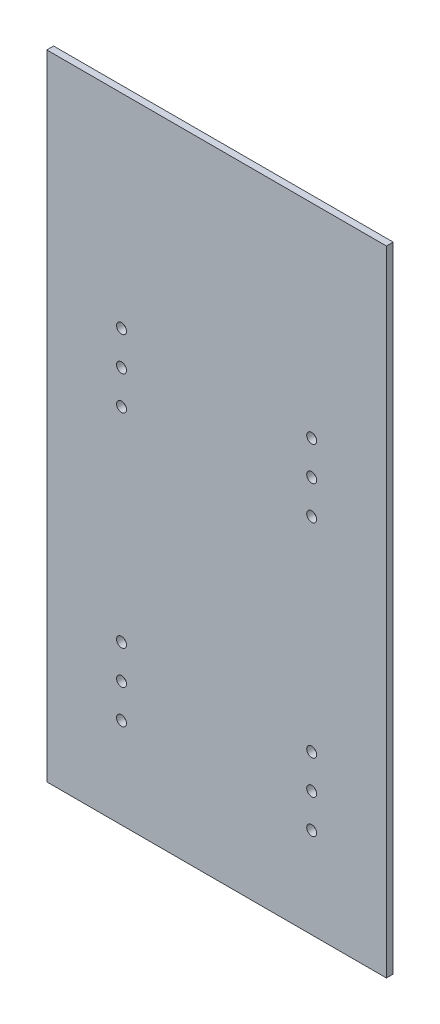
ISO-10303-21;
HEADER;
FILE_DESCRIPTION(('STEP AP214'),'2;1');
FILE_NAME('part.step','',(''),(''),'','','');
FILE_SCHEMA(('AUTOMOTIVE_DESIGN { 1 0 10303 214 1 1 1 1 }'));
ENDSEC;
DATA;
#1=APPLICATION_CONTEXT('core data for automotive mechanical design processes');
#2=APPLICATION_PROTOCOL_DEFINITION('international standard','automotive_design',2000,#1);
#3=PRODUCT_CONTEXT('',#1,'mechanical');
#4=PRODUCT('Part','Part','',(#3));
#5=PRODUCT_RELATED_PRODUCT_CATEGORY('part','',(#4));
#6=PRODUCT_DEFINITION_FORMATION('','',#4);
#7=PRODUCT_DEFINITION_CONTEXT('part definition',#1,'design');
#8=PRODUCT_DEFINITION('design','',#6,#7);
#9=PRODUCT_DEFINITION_SHAPE('','',#8);
#10=(LENGTH_UNIT() NAMED_UNIT(*) SI_UNIT(.MILLI.,.METRE.));
#11=(NAMED_UNIT(*) PLANE_ANGLE_UNIT() SI_UNIT($,.RADIAN.));
#12=(NAMED_UNIT(*) SI_UNIT($,.STERADIAN.) SOLID_ANGLE_UNIT());
#13=UNCERTAINTY_MEASURE_WITH_UNIT(LENGTH_MEASURE(1.E-05),#10,'distance_accuracy_value','');
#14=(GEOMETRIC_REPRESENTATION_CONTEXT(3) GLOBAL_UNCERTAINTY_ASSIGNED_CONTEXT((#13)) GLOBAL_UNIT_ASSIGNED_CONTEXT((#10,
#11,#12)) REPRESENTATION_CONTEXT('',''));
#15=CARTESIAN_POINT('',(0.,0.,0.));
#16=DIRECTION('',(0.,0.,1.));
#17=DIRECTION('',(1.,0.,0.));
#18=AXIS2_PLACEMENT_3D('',#15,#16,#17);
#19=CARTESIAN_POINT('',(0.,0.,3.));
#20=DIRECTION('',(0.,0.,-1.));
#21=DIRECTION('',(-1.,0.,0.));
#22=AXIS2_PLACEMENT_3D('',#19,#20,#21);
#23=PLANE('',#22);
#24=CARTESIAN_POINT('',(263.043137643902,1067.69288200509,3.));
#25=DIRECTION('',(0.,0.,-1.));
#26=DIRECTION('',(-1.,0.,0.));
#27=AXIS2_PLACEMENT_3D('',#24,#25,#26);
#28=CIRCLE('',#27,2.20000000000012);
#29=CARTESIAN_POINT('',(260.843137643902,1067.69288200509,3.));
#30=VERTEX_POINT('',#29);
#31=EDGE_CURVE('E254',#30,#30,#28,.T.);
#32=ORIENTED_EDGE('',*,*,#31,.T.);
#33=EDGE_LOOP('',(#32));
#34=FACE_BOUND('',#33,.T.);
#35=CARTESIAN_POINT('',(263.043137643902,1082.69288200509,3.));
#36=DIRECTION('',(0.,0.,-1.));
#37=DIRECTION('',(-1.,0.,0.));
#38=AXIS2_PLACEMENT_3D('',#35,#36,#37);
#39=CIRCLE('',#38,2.20000000000012);
#40=CARTESIAN_POINT('',(260.843137643902,1082.69288200509,3.));
#41=VERTEX_POINT('',#40);
#42=EDGE_CURVE('E316',#41,#41,#39,.T.);
#43=ORIENTED_EDGE('',*,*,#42,.T.);
#44=EDGE_LOOP('',(#43));
#45=FACE_BOUND('',#44,.T.);
#46=CARTESIAN_POINT('',(179.043137643902,1082.69288200509,3.));
#47=DIRECTION('',(0.,0.,-1.));
#48=DIRECTION('',(-1.,0.,0.));
#49=AXIS2_PLACEMENT_3D('',#46,#47,#48);
#50=CIRCLE('',#49,2.20000000000014);
#51=CARTESIAN_POINT('',(176.843137643902,1082.69288200509,3.));
#52=VERTEX_POINT('',#51);
#53=EDGE_CURVE('E313',#52,#52,#50,.T.);
#54=ORIENTED_EDGE('',*,*,#53,.T.);
#55=EDGE_LOOP('',(#54));
#56=FACE_BOUND('',#55,.T.);
#57=CARTESIAN_POINT('',(179.043137643902,1067.69288200509,3.));
#58=DIRECTION('',(0.,0.,-1.));
#59=DIRECTION('',(-1.,0.,0.));
#60=AXIS2_PLACEMENT_3D('',#57,#58,#59);
#61=CIRCLE('',#60,2.20000000000014);
#62=CARTESIAN_POINT('',(176.843137643902,1067.69288200509,3.));
#63=VERTEX_POINT('',#62);
#64=EDGE_CURVE('E310',#63,#63,#61,.T.);
#65=ORIENTED_EDGE('',*,*,#64,.T.);
#66=EDGE_LOOP('',(#65));
#67=FACE_BOUND('',#66,.T.);
#68=CARTESIAN_POINT('',(179.043137643902,1052.69288200509,3.));
#69=DIRECTION('',(0.,0.,-1.));
#70=DIRECTION('',(-1.,0.,0.));
#71=AXIS2_PLACEMENT_3D('',#68,#69,#70);
#72=CIRCLE('',#71,2.20000000000014);
#73=CARTESIAN_POINT('',(176.843137643902,1052.69288200509,3.));
#74=VERTEX_POINT('',#73);
#75=EDGE_CURVE('E306',#74,#74,#72,.T.);
#76=ORIENTED_EDGE('',*,*,#75,.T.);
#77=EDGE_LOOP('',(#76));
#78=FACE_BOUND('',#77,.T.);
#79=CARTESIAN_POINT('',(179.043137643902,962.692882005094,3.));
#80=DIRECTION('',(0.,0.,-1.));
#81=DIRECTION('',(-1.,0.,0.));
#82=AXIS2_PLACEMENT_3D('',#79,#80,#81);
#83=CIRCLE('',#82,2.20000000000001);
#84=CARTESIAN_POINT('',(176.843137643902,962.692882005094,3.));
#85=VERTEX_POINT('',#84);
#86=EDGE_CURVE('E302',#85,#85,#83,.T.);
#87=ORIENTED_EDGE('',*,*,#86,.T.);
#88=EDGE_LOOP('',(#87));
#89=FACE_BOUND('',#88,.T.);
#90=CARTESIAN_POINT('',(179.043137643902,947.692882005094,3.));
#91=DIRECTION('',(0.,0.,-1.));
#92=DIRECTION('',(-1.,0.,0.));
#93=AXIS2_PLACEMENT_3D('',#90,#91,#92);
#94=CIRCLE('',#93,2.19999999999998);
#95=CARTESIAN_POINT('',(176.843137643902,947.692882005094,3.));
#96=VERTEX_POINT('',#95);
#97=EDGE_CURVE('E298',#96,#96,#94,.T.);
#98=ORIENTED_EDGE('',*,*,#97,.T.);
#99=EDGE_LOOP('',(#98));
#100=FACE_BOUND('',#99,.T.);
#101=CARTESIAN_POINT('',(179.043137643902,932.692882005094,3.));
#102=DIRECTION('',(0.,0.,-1.));
#103=DIRECTION('',(-1.,0.,0.));
#104=AXIS2_PLACEMENT_3D('',#101,#102,#103);
#105=CIRCLE('',#104,2.19999999999998);
#106=CARTESIAN_POINT('',(176.843137643902,932.692882005094,3.));
#107=VERTEX_POINT('',#106);
#108=EDGE_CURVE('E294',#107,#107,#105,.T.);
#109=ORIENTED_EDGE('',*,*,#108,.T.);
#110=EDGE_LOOP('',(#109));
#111=FACE_BOUND('',#110,.T.);
#112=CARTESIAN_POINT('',(263.043137643902,932.692882005094,3.));
#113=DIRECTION('',(0.,0.,-1.));
#114=DIRECTION('',(-1.,0.,0.));
#115=AXIS2_PLACEMENT_3D('',#112,#113,#114);
#116=CIRCLE('',#115,2.19999999999998);
#117=CARTESIAN_POINT('',(260.843137643902,932.692882005094,3.));
#118=VERTEX_POINT('',#117);
#119=EDGE_CURVE('E290',#118,#118,#116,.T.);
#120=ORIENTED_EDGE('',*,*,#119,.T.);
#121=EDGE_LOOP('',(#120));
#122=FACE_BOUND('',#121,.T.);
#123=CARTESIAN_POINT('',(263.043137643902,947.692882005094,3.));
#124=DIRECTION('',(0.,0.,-1.));
#125=DIRECTION('',(-1.,0.,0.));
#126=AXIS2_PLACEMENT_3D('',#123,#124,#125);
#127=CIRCLE('',#126,2.19999999999998);
#128=CARTESIAN_POINT('',(260.843137643902,947.692882005094,3.));
#129=VERTEX_POINT('',#128);
#130=EDGE_CURVE('E286',#129,#129,#127,.T.);
#131=ORIENTED_EDGE('',*,*,#130,.T.);
#132=EDGE_LOOP('',(#131));
#133=FACE_BOUND('',#132,.T.);
#134=CARTESIAN_POINT('',(263.043137643902,962.692882005094,3.));
#135=DIRECTION('',(0.,0.,-1.));
#136=DIRECTION('',(-1.,0.,0.));
#137=AXIS2_PLACEMENT_3D('',#134,#135,#136);
#138=CIRCLE('',#137,2.20000000000003);
#139=CARTESIAN_POINT('',(260.843137643902,962.692882005094,3.));
#140=VERTEX_POINT('',#139);
#141=EDGE_CURVE('E282',#140,#140,#138,.T.);
#142=ORIENTED_EDGE('',*,*,#141,.T.);
#143=EDGE_LOOP('',(#142));
#144=FACE_BOUND('',#143,.T.);
#145=CARTESIAN_POINT('',(263.043137643902,1052.69288200509,3.));
#146=DIRECTION('',(0.,0.,-1.));
#147=DIRECTION('',(-1.,0.,0.));
#148=AXIS2_PLACEMENT_3D('',#145,#146,#147);
#149=CIRCLE('',#148,2.20000000000012);
#150=CARTESIAN_POINT('',(260.843137643902,1052.69288200509,3.));
#151=VERTEX_POINT('',#150);
#152=EDGE_CURVE('E278',#151,#151,#149,.T.);
#153=ORIENTED_EDGE('',*,*,#152,.T.);
#154=EDGE_LOOP('',(#153));
#155=FACE_BOUND('',#154,.T.);
#156=DIRECTION('',(0.,-1.,0.));
#157=VECTOR('',#156,1.);
#158=CARTESIAN_POINT('',(146.043137643902,1172.69288200509,3.));
#159=LINE('',#158,#157);
#160=CARTESIAN_POINT('',(146.043137643902,1172.69288200509,3.));
#161=VERTEX_POINT('',#160);
#162=CARTESIAN_POINT('',(146.043137643902,892.692882005094,3.));
#163=VERTEX_POINT('',#162);
#164=EDGE_CURVE('E182',#161,#163,#159,.T.);
#165=ORIENTED_EDGE('',*,*,#164,.T.);
#166=DIRECTION('',(1.,0.,0.));
#167=VECTOR('',#166,1.);
#168=CARTESIAN_POINT('',(296.043137643902,892.692882005094,3.));
#169=LINE('',#168,#167);
#170=CARTESIAN_POINT('',(296.043137643902,892.692882005094,3.));
#171=VERTEX_POINT('',#170);
#172=EDGE_CURVE('E228',#163,#171,#169,.T.);
#173=ORIENTED_EDGE('',*,*,#172,.T.);
#174=DIRECTION('',(0.,1.,0.));
#175=VECTOR('',#174,1.);
#176=CARTESIAN_POINT('',(296.043137643902,1172.69288200509,3.));
#177=LINE('',#176,#175);
#178=CARTESIAN_POINT('',(296.043137643902,1172.69288200509,3.));
#179=VERTEX_POINT('',#178);
#180=EDGE_CURVE('E209',#171,#179,#177,.T.);
#181=ORIENTED_EDGE('',*,*,#180,.T.);
#182=DIRECTION('',(-1.,0.,0.));
#183=VECTOR('',#182,1.);
#184=CARTESIAN_POINT('',(296.043137643902,1172.69288200509,3.));
#185=LINE('',#184,#183);
#186=EDGE_CURVE('E203',#179,#161,#185,.T.);
#187=ORIENTED_EDGE('',*,*,#186,.T.);
#188=EDGE_LOOP('',(#165,#173,#181,#187));
#189=FACE_BOUND('',#188,.T.);
#190=ADVANCED_FACE('F173',(#34,#45,#56,#67,#78,#89,#100,#111,#122,#133,#144,#155,#189),#23,.F.);
#191=CARTESIAN_POINT('',(0.,0.,0.));
#192=DIRECTION('',(0.,0.,-1.));
#193=DIRECTION('',(-1.,0.,0.));
#194=AXIS2_PLACEMENT_3D('',#191,#192,#193);
#195=PLANE('',#194);
#196=CARTESIAN_POINT('',(263.043137643902,1067.69288200509,0.));
#197=DIRECTION('',(0.,0.,-1.));
#198=DIRECTION('',(-1.,0.,0.));
#199=AXIS2_PLACEMENT_3D('',#196,#197,#198);
#200=CIRCLE('',#199,2.20000000000012);
#201=CARTESIAN_POINT('',(260.843137643902,1067.69288200509,0.));
#202=VERTEX_POINT('',#201);
#203=EDGE_CURVE('E176',#202,#202,#200,.T.);
#204=ORIENTED_EDGE('',*,*,#203,.F.);
#205=EDGE_LOOP('',(#204));
#206=FACE_BOUND('',#205,.T.);
#207=CARTESIAN_POINT('',(263.043137643902,1082.69288200509,0.));
#208=DIRECTION('',(0.,0.,-1.));
#209=DIRECTION('',(-1.,0.,0.));
#210=AXIS2_PLACEMENT_3D('',#207,#208,#209);
#211=CIRCLE('',#210,2.20000000000012);
#212=CARTESIAN_POINT('',(260.843137643902,1082.69288200509,0.));
#213=VERTEX_POINT('',#212);
#214=EDGE_CURVE('E314',#213,#213,#211,.T.);
#215=ORIENTED_EDGE('',*,*,#214,.F.);
#216=EDGE_LOOP('',(#215));
#217=FACE_BOUND('',#216,.T.);
#218=CARTESIAN_POINT('',(179.043137643902,1082.69288200509,0.));
#219=DIRECTION('',(0.,0.,-1.));
#220=DIRECTION('',(-1.,0.,0.));
#221=AXIS2_PLACEMENT_3D('',#218,#219,#220);
#222=CIRCLE('',#221,2.20000000000014);
#223=CARTESIAN_POINT('',(176.843137643902,1082.69288200509,0.));
#224=VERTEX_POINT('',#223);
#225=EDGE_CURVE('E311',#224,#224,#222,.T.);
#226=ORIENTED_EDGE('',*,*,#225,.F.);
#227=EDGE_LOOP('',(#226));
#228=FACE_BOUND('',#227,.T.);
#229=CARTESIAN_POINT('',(179.043137643902,1067.69288200509,0.));
#230=DIRECTION('',(0.,0.,-1.));
#231=DIRECTION('',(-1.,0.,0.));
#232=AXIS2_PLACEMENT_3D('',#229,#230,#231);
#233=CIRCLE('',#232,2.20000000000014);
#234=CARTESIAN_POINT('',(176.843137643902,1067.69288200509,0.));
#235=VERTEX_POINT('',#234);
#236=EDGE_CURVE('E307',#235,#235,#233,.T.);
#237=ORIENTED_EDGE('',*,*,#236,.F.);
#238=EDGE_LOOP('',(#237));
#239=FACE_BOUND('',#238,.T.);
#240=CARTESIAN_POINT('',(179.043137643902,1052.69288200509,0.));
#241=DIRECTION('',(0.,0.,-1.));
#242=DIRECTION('',(-1.,0.,0.));
#243=AXIS2_PLACEMENT_3D('',#240,#241,#242);
#244=CIRCLE('',#243,2.20000000000014);
#245=CARTESIAN_POINT('',(176.843137643902,1052.69288200509,0.));
#246=VERTEX_POINT('',#245);
#247=EDGE_CURVE('E303',#246,#246,#244,.T.);
#248=ORIENTED_EDGE('',*,*,#247,.F.);
#249=EDGE_LOOP('',(#248));
#250=FACE_BOUND('',#249,.T.);
#251=CARTESIAN_POINT('',(179.043137643902,962.692882005094,0.));
#252=DIRECTION('',(0.,0.,-1.));
#253=DIRECTION('',(-1.,0.,0.));
#254=AXIS2_PLACEMENT_3D('',#251,#252,#253);
#255=CIRCLE('',#254,2.20000000000001);
#256=CARTESIAN_POINT('',(176.843137643902,962.692882005094,0.));
#257=VERTEX_POINT('',#256);
#258=EDGE_CURVE('E299',#257,#257,#255,.T.);
#259=ORIENTED_EDGE('',*,*,#258,.F.);
#260=EDGE_LOOP('',(#259));
#261=FACE_BOUND('',#260,.T.);
#262=CARTESIAN_POINT('',(179.043137643902,947.692882005094,0.));
#263=DIRECTION('',(0.,0.,-1.));
#264=DIRECTION('',(-1.,0.,0.));
#265=AXIS2_PLACEMENT_3D('',#262,#263,#264);
#266=CIRCLE('',#265,2.19999999999998);
#267=CARTESIAN_POINT('',(176.843137643902,947.692882005094,0.));
#268=VERTEX_POINT('',#267);
#269=EDGE_CURVE('E295',#268,#268,#266,.T.);
#270=ORIENTED_EDGE('',*,*,#269,.F.);
#271=EDGE_LOOP('',(#270));
#272=FACE_BOUND('',#271,.T.);
#273=CARTESIAN_POINT('',(179.043137643902,932.692882005094,0.));
#274=DIRECTION('',(0.,0.,-1.));
#275=DIRECTION('',(-1.,0.,0.));
#276=AXIS2_PLACEMENT_3D('',#273,#274,#275);
#277=CIRCLE('',#276,2.19999999999998);
#278=CARTESIAN_POINT('',(176.843137643902,932.692882005094,0.));
#279=VERTEX_POINT('',#278);
#280=EDGE_CURVE('E291',#279,#279,#277,.T.);
#281=ORIENTED_EDGE('',*,*,#280,.F.);
#282=EDGE_LOOP('',(#281));
#283=FACE_BOUND('',#282,.T.);
#284=CARTESIAN_POINT('',(263.043137643902,932.692882005094,0.));
#285=DIRECTION('',(0.,0.,-1.));
#286=DIRECTION('',(-1.,0.,0.));
#287=AXIS2_PLACEMENT_3D('',#284,#285,#286);
#288=CIRCLE('',#287,2.19999999999998);
#289=CARTESIAN_POINT('',(260.843137643902,932.692882005094,0.));
#290=VERTEX_POINT('',#289);
#291=EDGE_CURVE('E287',#290,#290,#288,.T.);
#292=ORIENTED_EDGE('',*,*,#291,.F.);
#293=EDGE_LOOP('',(#292));
#294=FACE_BOUND('',#293,.T.);
#295=CARTESIAN_POINT('',(263.043137643902,947.692882005094,0.));
#296=DIRECTION('',(0.,0.,-1.));
#297=DIRECTION('',(-1.,0.,0.));
#298=AXIS2_PLACEMENT_3D('',#295,#296,#297);
#299=CIRCLE('',#298,2.19999999999998);
#300=CARTESIAN_POINT('',(260.843137643902,947.692882005094,0.));
#301=VERTEX_POINT('',#300);
#302=EDGE_CURVE('E283',#301,#301,#299,.T.);
#303=ORIENTED_EDGE('',*,*,#302,.F.);
#304=EDGE_LOOP('',(#303));
#305=FACE_BOUND('',#304,.T.);
#306=CARTESIAN_POINT('',(263.043137643902,962.692882005094,0.));
#307=DIRECTION('',(0.,0.,-1.));
#308=DIRECTION('',(-1.,0.,0.));
#309=AXIS2_PLACEMENT_3D('',#306,#307,#308);
#310=CIRCLE('',#309,2.20000000000003);
#311=CARTESIAN_POINT('',(260.843137643902,962.692882005094,0.));
#312=VERTEX_POINT('',#311);
#313=EDGE_CURVE('E279',#312,#312,#310,.T.);
#314=ORIENTED_EDGE('',*,*,#313,.F.);
#315=EDGE_LOOP('',(#314));
#316=FACE_BOUND('',#315,.T.);
#317=CARTESIAN_POINT('',(263.043137643902,1052.69288200509,0.));
#318=DIRECTION('',(0.,0.,-1.));
#319=DIRECTION('',(-1.,0.,0.));
#320=AXIS2_PLACEMENT_3D('',#317,#318,#319);
#321=CIRCLE('',#320,2.20000000000012);
#322=CARTESIAN_POINT('',(260.843137643902,1052.69288200509,0.));
#323=VERTEX_POINT('',#322);
#324=EDGE_CURVE('E275',#323,#323,#321,.T.);
#325=ORIENTED_EDGE('',*,*,#324,.F.);
#326=EDGE_LOOP('',(#325));
#327=FACE_BOUND('',#326,.T.);
#328=DIRECTION('',(0.,-1.,0.));
#329=VECTOR('',#328,1.);
#330=CARTESIAN_POINT('',(146.043137643902,1172.69288200509,0.));
#331=LINE('',#330,#329);
#332=CARTESIAN_POINT('',(146.043137643902,1172.69288200509,0.));
#333=VERTEX_POINT('',#332);
#334=CARTESIAN_POINT('',(146.043137643902,892.692882005094,0.));
#335=VERTEX_POINT('',#334);
#336=EDGE_CURVE('E12',#333,#335,#331,.T.);
#337=ORIENTED_EDGE('',*,*,#336,.F.);
#338=DIRECTION('',(-1.,0.,0.));
#339=VECTOR('',#338,1.);
#340=CARTESIAN_POINT('',(296.043137643902,1172.69288200509,0.));
#341=LINE('',#340,#339);
#342=CARTESIAN_POINT('',(296.043137643902,1172.69288200509,0.));
#343=VERTEX_POINT('',#342);
#344=EDGE_CURVE('E235',#343,#333,#341,.T.);
#345=ORIENTED_EDGE('',*,*,#344,.F.);
#346=DIRECTION('',(0.,1.,0.));
#347=VECTOR('',#346,1.);
#348=CARTESIAN_POINT('',(296.043137643902,1172.69288200509,0.));
#349=LINE('',#348,#347);
#350=CARTESIAN_POINT('',(296.043137643902,892.692882005094,0.));
#351=VERTEX_POINT('',#350);
#352=EDGE_CURVE('E220',#351,#343,#349,.T.);
#353=ORIENTED_EDGE('',*,*,#352,.F.);
#354=DIRECTION('',(1.,0.,0.));
#355=VECTOR('',#354,1.);
#356=CARTESIAN_POINT('',(296.043137643902,892.692882005094,0.));
#357=LINE('',#356,#355);
#358=EDGE_CURVE('E216',#335,#351,#357,.T.);
#359=ORIENTED_EDGE('',*,*,#358,.F.);
#360=EDGE_LOOP('',(#337,#345,#353,#359));
#361=FACE_BOUND('',#360,.T.);
#362=ADVANCED_FACE('F218',(#206,#217,#228,#239,#250,#261,#272,#283,#294,#305,#316,#327,#361),
#195,.T.);
#363=CARTESIAN_POINT('',(296.043137643902,1172.69288200509,0.));
#364=DIRECTION('',(0.,1.,0.));
#365=DIRECTION('',(-1.,0.,0.));
#366=AXIS2_PLACEMENT_3D('',#363,#364,#365);
#367=PLANE('',#366);
#368=ORIENTED_EDGE('',*,*,#186,.F.);
#369=DIRECTION('',(0.,0.,1.));
#370=VECTOR('',#369,1.);
#371=CARTESIAN_POINT('',(296.043137643902,1172.69288200509,0.));
#372=LINE('',#371,#370);
#373=EDGE_CURVE('E239',#343,#179,#372,.T.);
#374=ORIENTED_EDGE('',*,*,#373,.F.);
#375=ORIENTED_EDGE('',*,*,#344,.T.);
#376=DIRECTION('',(0.,0.,1.));
#377=VECTOR('',#376,1.);
#378=CARTESIAN_POINT('',(146.043137643902,1172.69288200509,0.));
#379=LINE('',#378,#377);
#380=EDGE_CURVE('E232',#333,#161,#379,.T.);
#381=ORIENTED_EDGE('',*,*,#380,.T.);
#382=EDGE_LOOP('',(#368,#374,#375,#381));
#383=FACE_BOUND('',#382,.T.);
#384=ADVANCED_FACE('F238',(#383),#367,.T.);
#385=CARTESIAN_POINT('',(296.043137643902,1172.69288200509,0.));
#386=DIRECTION('',(1.,0.,0.));
#387=DIRECTION('',(0.,0.,-1.));
#388=AXIS2_PLACEMENT_3D('',#385,#386,#387);
#389=PLANE('',#388);
#390=ORIENTED_EDGE('',*,*,#180,.F.);
#391=DIRECTION('',(0.,0.,1.));
#392=VECTOR('',#391,1.);
#393=CARTESIAN_POINT('',(296.043137643902,892.692882005094,0.));
#394=LINE('',#393,#392);
#395=EDGE_CURVE('E263',#351,#171,#394,.T.);
#396=ORIENTED_EDGE('',*,*,#395,.F.);
#397=ORIENTED_EDGE('',*,*,#352,.T.);
#398=ORIENTED_EDGE('',*,*,#373,.T.);
#399=EDGE_LOOP('',(#390,#396,#397,#398));
#400=FACE_BOUND('',#399,.T.);
#401=ADVANCED_FACE('F407',(#400),#389,.T.);
#402=CARTESIAN_POINT('',(296.043137643902,892.692882005094,0.));
#403=DIRECTION('',(0.,-1.,0.));
#404=DIRECTION('',(1.,0.,0.));
#405=AXIS2_PLACEMENT_3D('',#402,#403,#404);
#406=PLANE('',#405);
#407=ORIENTED_EDGE('',*,*,#172,.F.);
#408=DIRECTION('',(0.,0.,1.));
#409=VECTOR('',#408,1.);
#410=CARTESIAN_POINT('',(146.043137643902,892.692882005094,0.));
#411=LINE('',#410,#409);
#412=EDGE_CURVE('E224',#335,#163,#411,.T.);
#413=ORIENTED_EDGE('',*,*,#412,.F.);
#414=ORIENTED_EDGE('',*,*,#358,.T.);
#415=ORIENTED_EDGE('',*,*,#395,.T.);
#416=EDGE_LOOP('',(#407,#413,#414,#415));
#417=FACE_BOUND('',#416,.T.);
#418=ADVANCED_FACE('F227',(#417),#406,.T.);
#419=CARTESIAN_POINT('',(146.043137643902,1172.69288200509,0.));
#420=DIRECTION('',(-1.,0.,0.));
#421=DIRECTION('',(0.,0.,1.));
#422=AXIS2_PLACEMENT_3D('',#419,#420,#421);
#423=PLANE('',#422);
#424=ORIENTED_EDGE('',*,*,#164,.F.);
#425=ORIENTED_EDGE('',*,*,#380,.F.);
#426=ORIENTED_EDGE('',*,*,#336,.T.);
#427=ORIENTED_EDGE('',*,*,#412,.T.);
#428=EDGE_LOOP('',(#424,#425,#426,#427));
#429=FACE_BOUND('',#428,.T.);
#430=ADVANCED_FACE('F231',(#429),#423,.T.);
#431=CARTESIAN_POINT('',(263.043137643902,1052.69288200509,5.99999999999912));
#432=DIRECTION('',(0.,0.,-1.));
#433=DIRECTION('',(-1.,0.,0.));
#434=AXIS2_PLACEMENT_3D('',#431,#432,#433);
#435=CYLINDRICAL_SURFACE('',#434,2.20000000000012);
#436=ORIENTED_EDGE('',*,*,#324,.T.);
#437=EDGE_LOOP('',(#436));
#438=FACE_BOUND('',#437,.T.);
#439=ORIENTED_EDGE('',*,*,#152,.F.);
#440=EDGE_LOOP('',(#439));
#441=FACE_BOUND('',#440,.T.);
#442=ADVANCED_FACE('F360',(#438,#441),#435,.F.);
#443=CARTESIAN_POINT('',(263.043137643902,962.692882005094,5.99999999999912));
#444=DIRECTION('',(0.,0.,-1.));
#445=DIRECTION('',(-1.,0.,0.));
#446=AXIS2_PLACEMENT_3D('',#443,#444,#445);
#447=CYLINDRICAL_SURFACE('',#446,2.20000000000003);
#448=ORIENTED_EDGE('',*,*,#313,.T.);
#449=EDGE_LOOP('',(#448));
#450=FACE_BOUND('',#449,.T.);
#451=ORIENTED_EDGE('',*,*,#141,.F.);
#452=EDGE_LOOP('',(#451));
#453=FACE_BOUND('',#452,.T.);
#454=ADVANCED_FACE('F363',(#450,#453),#447,.F.);
#455=CARTESIAN_POINT('',(263.043137643902,947.692882005094,5.99999999999912));
#456=DIRECTION('',(0.,0.,-1.));
#457=DIRECTION('',(-1.,0.,0.));
#458=AXIS2_PLACEMENT_3D('',#455,#456,#457);
#459=CYLINDRICAL_SURFACE('',#458,2.19999999999998);
#460=ORIENTED_EDGE('',*,*,#302,.T.);
#461=EDGE_LOOP('',(#460));
#462=FACE_BOUND('',#461,.T.);
#463=ORIENTED_EDGE('',*,*,#130,.F.);
#464=EDGE_LOOP('',(#463));
#465=FACE_BOUND('',#464,.T.);
#466=ADVANCED_FACE('F438',(#462,#465),#459,.F.);
#467=CARTESIAN_POINT('',(263.043137643902,932.692882005094,5.99999999999912));
#468=DIRECTION('',(0.,0.,-1.));
#469=DIRECTION('',(-1.,0.,0.));
#470=AXIS2_PLACEMENT_3D('',#467,#468,#469);
#471=CYLINDRICAL_SURFACE('',#470,2.19999999999998);
#472=ORIENTED_EDGE('',*,*,#291,.T.);
#473=EDGE_LOOP('',(#472));
#474=FACE_BOUND('',#473,.T.);
#475=ORIENTED_EDGE('',*,*,#119,.F.);
#476=EDGE_LOOP('',(#475));
#477=FACE_BOUND('',#476,.T.);
#478=ADVANCED_FACE('F418',(#474,#477),#471,.F.);
#479=CARTESIAN_POINT('',(179.043137643902,932.692882005094,5.99999999999912));
#480=DIRECTION('',(0.,0.,-1.));
#481=DIRECTION('',(-1.,0.,0.));
#482=AXIS2_PLACEMENT_3D('',#479,#480,#481);
#483=CYLINDRICAL_SURFACE('',#482,2.19999999999998);
#484=ORIENTED_EDGE('',*,*,#280,.T.);
#485=EDGE_LOOP('',(#484));
#486=FACE_BOUND('',#485,.T.);
#487=ORIENTED_EDGE('',*,*,#108,.F.);
#488=EDGE_LOOP('',(#487));
#489=FACE_BOUND('',#488,.T.);
#490=ADVANCED_FACE('F415',(#486,#489),#483,.F.);
#491=CARTESIAN_POINT('',(179.043137643902,947.692882005094,5.99999999999912));
#492=DIRECTION('',(0.,0.,-1.));
#493=DIRECTION('',(-1.,0.,0.));
#494=AXIS2_PLACEMENT_3D('',#491,#492,#493);
#495=CYLINDRICAL_SURFACE('',#494,2.19999999999998);
#496=ORIENTED_EDGE('',*,*,#269,.T.);
#497=EDGE_LOOP('',(#496));
#498=FACE_BOUND('',#497,.T.);
#499=ORIENTED_EDGE('',*,*,#97,.F.);
#500=EDGE_LOOP('',(#499));
#501=FACE_BOUND('',#500,.T.);
#502=ADVANCED_FACE('F399',(#498,#501),#495,.F.);
#503=CARTESIAN_POINT('',(179.043137643902,962.692882005094,5.99999999999912));
#504=DIRECTION('',(0.,0.,-1.));
#505=DIRECTION('',(-1.,0.,0.));
#506=AXIS2_PLACEMENT_3D('',#503,#504,#505);
#507=CYLINDRICAL_SURFACE('',#506,2.20000000000001);
#508=ORIENTED_EDGE('',*,*,#258,.T.);
#509=EDGE_LOOP('',(#508));
#510=FACE_BOUND('',#509,.T.);
#511=ORIENTED_EDGE('',*,*,#86,.F.);
#512=EDGE_LOOP('',(#511));
#513=FACE_BOUND('',#512,.T.);
#514=ADVANCED_FACE('F389',(#510,#513),#507,.F.);
#515=CARTESIAN_POINT('',(179.043137643902,1052.69288200509,5.99999999999912));
#516=DIRECTION('',(0.,0.,-1.));
#517=DIRECTION('',(-1.,0.,0.));
#518=AXIS2_PLACEMENT_3D('',#515,#516,#517);
#519=CYLINDRICAL_SURFACE('',#518,2.20000000000014);
#520=ORIENTED_EDGE('',*,*,#247,.T.);
#521=EDGE_LOOP('',(#520));
#522=FACE_BOUND('',#521,.T.);
#523=ORIENTED_EDGE('',*,*,#75,.F.);
#524=EDGE_LOOP('',(#523));
#525=FACE_BOUND('',#524,.T.);
#526=ADVANCED_FACE('F386',(#522,#525),#519,.F.);
#527=CARTESIAN_POINT('',(179.043137643902,1067.69288200509,5.99999999999912));
#528=DIRECTION('',(0.,0.,-1.));
#529=DIRECTION('',(-1.,0.,0.));
#530=AXIS2_PLACEMENT_3D('',#527,#528,#529);
#531=CYLINDRICAL_SURFACE('',#530,2.20000000000014);
#532=ORIENTED_EDGE('',*,*,#236,.T.);
#533=EDGE_LOOP('',(#532));
#534=FACE_BOUND('',#533,.T.);
#535=ORIENTED_EDGE('',*,*,#64,.F.);
#536=EDGE_LOOP('',(#535));
#537=FACE_BOUND('',#536,.T.);
#538=ADVANCED_FACE('F388',(#534,#537),#531,.F.);
#539=CARTESIAN_POINT('',(179.043137643902,1082.69288200509,5.99999999999912));
#540=DIRECTION('',(0.,0.,-1.));
#541=DIRECTION('',(-1.,0.,0.));
#542=AXIS2_PLACEMENT_3D('',#539,#540,#541);
#543=CYLINDRICAL_SURFACE('',#542,2.20000000000014);
#544=ORIENTED_EDGE('',*,*,#225,.T.);
#545=EDGE_LOOP('',(#544));
#546=FACE_BOUND('',#545,.T.);
#547=ORIENTED_EDGE('',*,*,#53,.F.);
#548=EDGE_LOOP('',(#547));
#549=FACE_BOUND('',#548,.T.);
#550=ADVANCED_FACE('F396',(#546,#549),#543,.F.);
#551=CARTESIAN_POINT('',(263.043137643902,1082.69288200509,5.99999999999912));
#552=DIRECTION('',(0.,0.,-1.));
#553=DIRECTION('',(-1.,0.,0.));
#554=AXIS2_PLACEMENT_3D('',#551,#552,#553);
#555=CYLINDRICAL_SURFACE('',#554,2.20000000000012);
#556=ORIENTED_EDGE('',*,*,#214,.T.);
#557=EDGE_LOOP('',(#556));
#558=FACE_BOUND('',#557,.T.);
#559=ORIENTED_EDGE('',*,*,#42,.F.);
#560=EDGE_LOOP('',(#559));
#561=FACE_BOUND('',#560,.T.);
#562=ADVANCED_FACE('F450',(#558,#561),#555,.F.);
#563=CARTESIAN_POINT('',(263.043137643902,1067.69288200509,5.99999999999912));
#564=DIRECTION('',(0.,0.,-1.));
#565=DIRECTION('',(-1.,0.,0.));
#566=AXIS2_PLACEMENT_3D('',#563,#564,#565);
#567=CYLINDRICAL_SURFACE('',#566,2.20000000000012);
#568=ORIENTED_EDGE('',*,*,#203,.T.);
#569=EDGE_LOOP('',(#568));
#570=FACE_BOUND('',#569,.T.);
#571=ORIENTED_EDGE('',*,*,#31,.F.);
#572=EDGE_LOOP('',(#571));
#573=FACE_BOUND('',#572,.T.);
#574=ADVANCED_FACE('F334',(#570,#573),#567,.F.);
#575=CLOSED_SHELL('',(#190,#362,#384,#401,#418,#430,#442,#454,#466,#478,#490,#502,#514,#526,
#538,#550,#562,#574));
#576=MANIFOLD_SOLID_BREP('B2',#575);
#577=ADVANCED_BREP_SHAPE_REPRESENTATION('',(#18,#576),#14);
#578=SHAPE_DEFINITION_REPRESENTATION(#9,#577);
ENDSEC;
END-ISO-10303-21;
